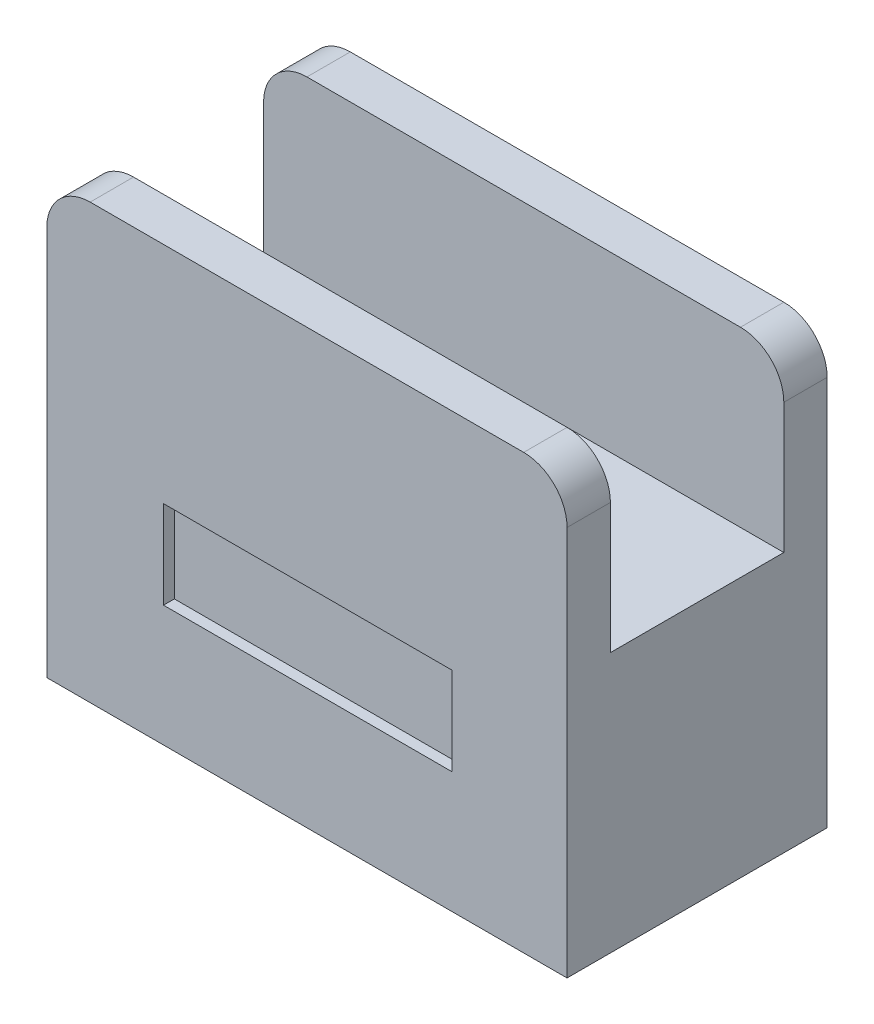
ISO-10303-21;
HEADER;
FILE_DESCRIPTION(('STEP AP214'),'2;1');
FILE_NAME('part.step','',(''),(''),'','','');
FILE_SCHEMA(('AUTOMOTIVE_DESIGN { 1 0 10303 214 1 1 1 1 }'));
ENDSEC;
DATA;
#1=APPLICATION_CONTEXT('core data for automotive mechanical design processes');
#2=APPLICATION_PROTOCOL_DEFINITION('international standard','automotive_design',2000,#1);
#3=PRODUCT_CONTEXT('',#1,'mechanical');
#4=PRODUCT('Part','Part','',(#3));
#5=PRODUCT_RELATED_PRODUCT_CATEGORY('part','',(#4));
#6=PRODUCT_DEFINITION_FORMATION('','',#4);
#7=PRODUCT_DEFINITION_CONTEXT('part definition',#1,'design');
#8=PRODUCT_DEFINITION('design','',#6,#7);
#9=PRODUCT_DEFINITION_SHAPE('','',#8);
#10=(LENGTH_UNIT() NAMED_UNIT(*) SI_UNIT(.MILLI.,.METRE.));
#11=(NAMED_UNIT(*) PLANE_ANGLE_UNIT() SI_UNIT($,.RADIAN.));
#12=(NAMED_UNIT(*) SI_UNIT($,.STERADIAN.) SOLID_ANGLE_UNIT());
#13=UNCERTAINTY_MEASURE_WITH_UNIT(LENGTH_MEASURE(1.E-05),#10,'distance_accuracy_value','');
#14=(GEOMETRIC_REPRESENTATION_CONTEXT(3) GLOBAL_UNCERTAINTY_ASSIGNED_CONTEXT((#13)) GLOBAL_UNIT_ASSIGNED_CONTEXT((#10,
#11,#12)) REPRESENTATION_CONTEXT('',''));
#15=CARTESIAN_POINT('',(0.,0.,0.));
#16=DIRECTION('',(0.,0.,1.));
#17=DIRECTION('',(1.,0.,0.));
#18=AXIS2_PLACEMENT_3D('',#15,#16,#17);
#19=CARTESIAN_POINT('',(0.,76.2,76.2));
#20=DIRECTION('',(0.,-1.,0.));
#21=DIRECTION('',(0.,0.,-1.));
#22=AXIS2_PLACEMENT_3D('',#19,#20,#21);
#23=PLANE('',#22);
#24=DIRECTION('',(0.,0.,-1.));
#25=VECTOR('',#24,1.);
#26=CARTESIAN_POINT('',(0.,76.2,76.2));
#27=LINE('',#26,#25);
#28=CARTESIAN_POINT('',(0.,76.2,63.5));
#29=VERTEX_POINT('',#28);
#30=CARTESIAN_POINT('',(0.,76.2,12.7));
#31=VERTEX_POINT('',#30);
#32=EDGE_CURVE('E253',#29,#31,#27,.T.);
#33=ORIENTED_EDGE('',*,*,#32,.F.);
#34=DIRECTION('',(1.,0.,0.));
#35=VECTOR('',#34,1.);
#36=CARTESIAN_POINT('',(0.,76.2,63.5));
#37=LINE('',#36,#35);
#38=CARTESIAN_POINT('',(152.4,76.2,63.5));
#39=VERTEX_POINT('',#38);
#40=EDGE_CURVE('E201',#29,#39,#37,.T.);
#41=ORIENTED_EDGE('',*,*,#40,.T.);
#42=DIRECTION('',(0.,0.,-1.));
#43=VECTOR('',#42,1.);
#44=CARTESIAN_POINT('',(152.4,76.2,76.2));
#45=LINE('',#44,#43);
#46=CARTESIAN_POINT('',(152.4,76.2,12.7));
#47=VERTEX_POINT('',#46);
#48=EDGE_CURVE('E265',#39,#47,#45,.T.);
#49=ORIENTED_EDGE('',*,*,#48,.T.);
#50=DIRECTION('',(1.,0.,0.));
#51=VECTOR('',#50,1.);
#52=CARTESIAN_POINT('',(0.,76.2,12.7));
#53=LINE('',#52,#51);
#54=EDGE_CURVE('E223',#31,#47,#53,.T.);
#55=ORIENTED_EDGE('',*,*,#54,.F.);
#56=EDGE_LOOP('',(#33,#41,#49,#55));
#57=FACE_BOUND('',#56,.T.);
#58=ADVANCED_FACE('F41',(#57),#23,.F.);
#59=CARTESIAN_POINT('',(0.,0.,76.2));
#60=DIRECTION('',(1.,0.,0.));
#61=DIRECTION('',(0.,0.,-1.));
#62=AXIS2_PLACEMENT_3D('',#59,#60,#61);
#63=PLANE('',#62);
#64=DIRECTION('',(0.,-1.,0.));
#65=VECTOR('',#64,1.);
#66=CARTESIAN_POINT('',(0.,127.,12.7));
#67=LINE('',#66,#65);
#68=CARTESIAN_POINT('',(0.,114.3,12.7));
#69=VERTEX_POINT('',#68);
#70=EDGE_CURVE('E238',#69,#31,#67,.T.);
#71=ORIENTED_EDGE('',*,*,#70,.F.);
#72=DIRECTION('',(0.,0.,1.));
#73=VECTOR('',#72,1.);
#74=CARTESIAN_POINT('',(0.,114.3,0.));
#75=LINE('',#74,#73);
#76=CARTESIAN_POINT('',(0.,114.3,0.));
#77=VERTEX_POINT('',#76);
#78=EDGE_CURVE('E295',#69,#77,#75,.F.);
#79=ORIENTED_EDGE('',*,*,#78,.T.);
#80=DIRECTION('',(0.,-1.,0.));
#81=VECTOR('',#80,1.);
#82=CARTESIAN_POINT('',(0.,0.,0.));
#83=LINE('',#82,#81);
#84=CARTESIAN_POINT('',(0.,0.,0.));
#85=VERTEX_POINT('',#84);
#86=EDGE_CURVE('E241',#77,#85,#83,.T.);
#87=ORIENTED_EDGE('',*,*,#86,.T.);
#88=DIRECTION('',(0.,0.,-1.));
#89=VECTOR('',#88,1.);
#90=CARTESIAN_POINT('',(0.,0.,76.2));
#91=LINE('',#90,#89);
#92=CARTESIAN_POINT('',(0.,0.,76.2));
#93=VERTEX_POINT('',#92);
#94=EDGE_CURVE('E273',#93,#85,#91,.T.);
#95=ORIENTED_EDGE('',*,*,#94,.F.);
#96=DIRECTION('',(0.,-1.,0.));
#97=VECTOR('',#96,1.);
#98=CARTESIAN_POINT('',(0.,0.,76.2));
#99=LINE('',#98,#97);
#100=CARTESIAN_POINT('',(0.,114.3,76.2));
#101=VERTEX_POINT('',#100);
#102=EDGE_CURVE('E242',#101,#93,#99,.T.);
#103=ORIENTED_EDGE('',*,*,#102,.F.);
#104=DIRECTION('',(0.,0.,-1.));
#105=VECTOR('',#104,1.);
#106=CARTESIAN_POINT('',(0.,114.3,63.5));
#107=LINE('',#106,#105);
#108=CARTESIAN_POINT('',(0.,114.3,63.5));
#109=VERTEX_POINT('',#108);
#110=EDGE_CURVE('E291',#101,#109,#107,.T.);
#111=ORIENTED_EDGE('',*,*,#110,.T.);
#112=DIRECTION('',(0.,-1.,0.));
#113=VECTOR('',#112,1.);
#114=CARTESIAN_POINT('',(0.,127.,63.5));
#115=LINE('',#114,#113);
#116=EDGE_CURVE('E214',#109,#29,#115,.T.);
#117=ORIENTED_EDGE('',*,*,#116,.T.);
#118=ORIENTED_EDGE('',*,*,#32,.T.);
#119=EDGE_LOOP('',(#71,#79,#87,#95,#103,#111,#117,#118));
#120=FACE_BOUND('',#119,.T.);
#121=ADVANCED_FACE('F339',(#120),#63,.F.);
#122=CARTESIAN_POINT('',(0.,0.,76.2));
#123=DIRECTION('',(0.,1.,0.));
#124=DIRECTION('',(0.,0.,1.));
#125=AXIS2_PLACEMENT_3D('',#122,#123,#124);
#126=PLANE('',#125);
#127=DIRECTION('',(1.,0.,0.));
#128=VECTOR('',#127,1.);
#129=CARTESIAN_POINT('',(0.,0.,0.));
#130=LINE('',#129,#128);
#131=CARTESIAN_POINT('',(152.4,0.,0.));
#132=VERTEX_POINT('',#131);
#133=EDGE_CURVE('E256',#85,#132,#130,.T.);
#134=ORIENTED_EDGE('',*,*,#133,.T.);
#135=DIRECTION('',(0.,0.,-1.));
#136=VECTOR('',#135,1.);
#137=CARTESIAN_POINT('',(152.4,0.,76.2));
#138=LINE('',#137,#136);
#139=CARTESIAN_POINT('',(152.4,0.,76.2));
#140=VERTEX_POINT('',#139);
#141=EDGE_CURVE('E269',#140,#132,#138,.T.);
#142=ORIENTED_EDGE('',*,*,#141,.F.);
#143=DIRECTION('',(1.,0.,0.));
#144=VECTOR('',#143,1.);
#145=CARTESIAN_POINT('',(0.,0.,76.2));
#146=LINE('',#145,#144);
#147=EDGE_CURVE('E245',#93,#140,#146,.T.);
#148=ORIENTED_EDGE('',*,*,#147,.F.);
#149=ORIENTED_EDGE('',*,*,#94,.T.);
#150=EDGE_LOOP('',(#134,#142,#148,#149));
#151=FACE_BOUND('',#150,.T.);
#152=ADVANCED_FACE('F343',(#151),#126,.F.);
#153=CARTESIAN_POINT('',(152.4,0.,76.2));
#154=DIRECTION('',(-1.,0.,0.));
#155=DIRECTION('',(0.,0.,1.));
#156=AXIS2_PLACEMENT_3D('',#153,#154,#155);
#157=PLANE('',#156);
#158=DIRECTION('',(0.,1.,0.));
#159=VECTOR('',#158,1.);
#160=CARTESIAN_POINT('',(152.4,0.,0.));
#161=LINE('',#160,#159);
#162=CARTESIAN_POINT('',(152.4,114.3,0.));
#163=VERTEX_POINT('',#162);
#164=EDGE_CURVE('E246',#132,#163,#161,.T.);
#165=ORIENTED_EDGE('',*,*,#164,.T.);
#166=DIRECTION('',(0.,0.,-1.));
#167=VECTOR('',#166,1.);
#168=CARTESIAN_POINT('',(152.4,114.3,12.7));
#169=LINE('',#168,#167);
#170=CARTESIAN_POINT('',(152.4,114.3,12.7));
#171=VERTEX_POINT('',#170);
#172=EDGE_CURVE('E308',#163,#171,#169,.F.);
#173=ORIENTED_EDGE('',*,*,#172,.T.);
#174=DIRECTION('',(0.,-1.,0.));
#175=VECTOR('',#174,1.);
#176=CARTESIAN_POINT('',(152.4,127.,12.7));
#177=LINE('',#176,#175);
#178=EDGE_CURVE('E232',#171,#47,#177,.T.);
#179=ORIENTED_EDGE('',*,*,#178,.T.);
#180=ORIENTED_EDGE('',*,*,#48,.F.);
#181=DIRECTION('',(0.,-1.,0.));
#182=VECTOR('',#181,1.);
#183=CARTESIAN_POINT('',(152.4,127.,63.5));
#184=LINE('',#183,#182);
#185=CARTESIAN_POINT('',(152.4,114.3,63.5));
#186=VERTEX_POINT('',#185);
#187=EDGE_CURVE('E220',#186,#39,#184,.T.);
#188=ORIENTED_EDGE('',*,*,#187,.F.);
#189=DIRECTION('',(0.,0.,1.));
#190=VECTOR('',#189,1.);
#191=CARTESIAN_POINT('',(152.4,114.3,76.2));
#192=LINE('',#191,#190);
#193=CARTESIAN_POINT('',(152.4,114.3,76.2));
#194=VERTEX_POINT('',#193);
#195=EDGE_CURVE('E304',#186,#194,#192,.T.);
#196=ORIENTED_EDGE('',*,*,#195,.T.);
#197=DIRECTION('',(0.,1.,0.));
#198=VECTOR('',#197,1.);
#199=CARTESIAN_POINT('',(152.4,0.,76.2));
#200=LINE('',#199,#198);
#201=EDGE_CURVE('E249',#140,#194,#200,.T.);
#202=ORIENTED_EDGE('',*,*,#201,.F.);
#203=ORIENTED_EDGE('',*,*,#141,.T.);
#204=EDGE_LOOP('',(#165,#173,#179,#180,#188,#196,#202,#203));
#205=FACE_BOUND('',#204,.T.);
#206=ADVANCED_FACE('F347',(#205),#157,.F.);
#207=CARTESIAN_POINT('',(0.,0.,76.2));
#208=DIRECTION('',(0.,0.,-1.));
#209=DIRECTION('',(-1.,0.,0.));
#210=AXIS2_PLACEMENT_3D('',#207,#208,#209);
#211=PLANE('',#210);
#212=DIRECTION('',(1.,0.,0.));
#213=VECTOR('',#212,1.);
#214=CARTESIAN_POINT('',(34.1858706307789,35.4773433120243,76.2));
#215=LINE('',#214,#213);
#216=CARTESIAN_POINT('',(34.1858706307789,35.4773433120243,76.2));
#217=VERTEX_POINT('',#216);
#218=CARTESIAN_POINT('',(118.647915764399,35.4773433120243,76.2));
#219=VERTEX_POINT('',#218);
#220=EDGE_CURVE('E192',#217,#219,#215,.T.);
#221=ORIENTED_EDGE('',*,*,#220,.F.);
#222=DIRECTION('',(0.,-1.,0.));
#223=VECTOR('',#222,1.);
#224=CARTESIAN_POINT('',(34.1858706307789,61.2467638674303,76.2));
#225=LINE('',#224,#223);
#226=CARTESIAN_POINT('',(34.1858706307789,61.2467638674303,76.2));
#227=VERTEX_POINT('',#226);
#228=EDGE_CURVE('E57',#227,#217,#225,.T.);
#229=ORIENTED_EDGE('',*,*,#228,.F.);
#230=DIRECTION('',(-1.,0.,0.));
#231=VECTOR('',#230,1.);
#232=CARTESIAN_POINT('',(34.1858706307789,61.2467638674303,76.2));
#233=LINE('',#232,#231);
#234=CARTESIAN_POINT('',(118.647915764399,61.2467638674303,76.2));
#235=VERTEX_POINT('',#234);
#236=EDGE_CURVE('E179',#235,#227,#233,.T.);
#237=ORIENTED_EDGE('',*,*,#236,.F.);
#238=DIRECTION('',(0.,1.,0.));
#239=VECTOR('',#238,1.);
#240=CARTESIAN_POINT('',(118.647915764399,61.2467638674303,76.2));
#241=LINE('',#240,#239);
#242=EDGE_CURVE('E183',#219,#235,#241,.T.);
#243=ORIENTED_EDGE('',*,*,#242,.F.);
#244=EDGE_LOOP('',(#221,#229,#237,#243));
#245=FACE_BOUND('',#244,.T.);
#246=ORIENTED_EDGE('',*,*,#201,.T.);
#247=CARTESIAN_POINT('',(139.7,114.3,76.2));
#248=DIRECTION('',(0.,0.,-1.));
#249=DIRECTION('',(-1.,0.,0.));
#250=AXIS2_PLACEMENT_3D('',#247,#248,#249);
#251=CIRCLE('',#250,12.7);
#252=CARTESIAN_POINT('',(139.7,127.,76.2));
#253=VERTEX_POINT('',#252);
#254=EDGE_CURVE('E314',#194,#253,#251,.F.);
#255=ORIENTED_EDGE('',*,*,#254,.T.);
#256=DIRECTION('',(-1.,0.,0.));
#257=VECTOR('',#256,1.);
#258=CARTESIAN_POINT('',(0.,127.,76.2));
#259=LINE('',#258,#257);
#260=CARTESIAN_POINT('',(12.7,127.,76.2));
#261=VERTEX_POINT('',#260);
#262=EDGE_CURVE('E207',#253,#261,#259,.T.);
#263=ORIENTED_EDGE('',*,*,#262,.T.);
#264=CARTESIAN_POINT('',(12.7,114.3,76.2));
#265=DIRECTION('',(0.,0.,-1.));
#266=DIRECTION('',(-1.,0.,0.));
#267=AXIS2_PLACEMENT_3D('',#264,#265,#266);
#268=CIRCLE('',#267,12.7);
#269=EDGE_CURVE('E311',#261,#101,#268,.F.);
#270=ORIENTED_EDGE('',*,*,#269,.T.);
#271=ORIENTED_EDGE('',*,*,#102,.T.);
#272=ORIENTED_EDGE('',*,*,#147,.T.);
#273=EDGE_LOOP('',(#246,#255,#263,#270,#271,#272));
#274=FACE_BOUND('',#273,.T.);
#275=ADVANCED_FACE('F334',(#245,#274),#211,.F.);
#276=CARTESIAN_POINT('',(0.,0.,0.));
#277=DIRECTION('',(0.,0.,-1.));
#278=DIRECTION('',(-1.,0.,0.));
#279=AXIS2_PLACEMENT_3D('',#276,#277,#278);
#280=PLANE('',#279);
#281=ORIENTED_EDGE('',*,*,#86,.F.);
#282=CARTESIAN_POINT('',(12.7,114.3,0.));
#283=DIRECTION('',(0.,0.,-1.));
#284=DIRECTION('',(-1.,0.,0.));
#285=AXIS2_PLACEMENT_3D('',#282,#283,#284);
#286=CIRCLE('',#285,12.7);
#287=CARTESIAN_POINT('',(12.7,127.,0.));
#288=VERTEX_POINT('',#287);
#289=EDGE_CURVE('E301',#77,#288,#286,.T.);
#290=ORIENTED_EDGE('',*,*,#289,.T.);
#291=DIRECTION('',(-1.,0.,0.));
#292=VECTOR('',#291,1.);
#293=CARTESIAN_POINT('',(0.,127.,0.));
#294=LINE('',#293,#292);
#295=CARTESIAN_POINT('',(139.7,127.,0.));
#296=VERTEX_POINT('',#295);
#297=EDGE_CURVE('E228',#296,#288,#294,.T.);
#298=ORIENTED_EDGE('',*,*,#297,.F.);
#299=CARTESIAN_POINT('',(139.7,114.3,0.));
#300=DIRECTION('',(0.,0.,-1.));
#301=DIRECTION('',(-1.,0.,0.));
#302=AXIS2_PLACEMENT_3D('',#299,#300,#301);
#303=CIRCLE('',#302,12.7);
#304=EDGE_CURVE('E298',#296,#163,#303,.T.);
#305=ORIENTED_EDGE('',*,*,#304,.T.);
#306=ORIENTED_EDGE('',*,*,#164,.F.);
#307=ORIENTED_EDGE('',*,*,#133,.F.);
#308=EDGE_LOOP('',(#281,#290,#298,#305,#306,#307));
#309=FACE_BOUND('',#308,.T.);
#310=ADVANCED_FACE('F371',(#309),#280,.T.);
#311=CARTESIAN_POINT('',(0.,127.,12.7));
#312=DIRECTION('',(0.,0.,-1.));
#313=DIRECTION('',(-1.,0.,0.));
#314=AXIS2_PLACEMENT_3D('',#311,#312,#313);
#315=PLANE('',#314);
#316=DIRECTION('',(1.,0.,0.));
#317=VECTOR('',#316,1.);
#318=CARTESIAN_POINT('',(0.,127.,12.7));
#319=LINE('',#318,#317);
#320=CARTESIAN_POINT('',(12.7,127.,12.7));
#321=VERTEX_POINT('',#320);
#322=CARTESIAN_POINT('',(139.7,127.,12.7));
#323=VERTEX_POINT('',#322);
#324=EDGE_CURVE('E224',#321,#323,#319,.T.);
#325=ORIENTED_EDGE('',*,*,#324,.F.);
#326=CARTESIAN_POINT('',(12.7,114.3,12.7));
#327=DIRECTION('',(0.,0.,-1.));
#328=DIRECTION('',(-1.,0.,0.));
#329=AXIS2_PLACEMENT_3D('',#326,#327,#328);
#330=CIRCLE('',#329,12.7);
#331=EDGE_CURVE('E288',#321,#69,#330,.F.);
#332=ORIENTED_EDGE('',*,*,#331,.T.);
#333=ORIENTED_EDGE('',*,*,#70,.T.);
#334=ORIENTED_EDGE('',*,*,#54,.T.);
#335=ORIENTED_EDGE('',*,*,#178,.F.);
#336=CARTESIAN_POINT('',(139.7,114.3,12.7));
#337=DIRECTION('',(0.,0.,-1.));
#338=DIRECTION('',(-1.,0.,0.));
#339=AXIS2_PLACEMENT_3D('',#336,#337,#338);
#340=CIRCLE('',#339,12.7);
#341=EDGE_CURVE('E285',#171,#323,#340,.F.);
#342=ORIENTED_EDGE('',*,*,#341,.T.);
#343=EDGE_LOOP('',(#325,#332,#333,#334,#335,#342));
#344=FACE_BOUND('',#343,.T.);
#345=ADVANCED_FACE('F362',(#344),#315,.F.);
#346=CARTESIAN_POINT('',(0.,127.,0.));
#347=DIRECTION('',(0.,1.,0.));
#348=DIRECTION('',(0.,0.,1.));
#349=AXIS2_PLACEMENT_3D('',#346,#347,#348);
#350=PLANE('',#349);
#351=ORIENTED_EDGE('',*,*,#297,.T.);
#352=DIRECTION('',(0.,0.,1.));
#353=VECTOR('',#352,1.);
#354=CARTESIAN_POINT('',(12.7,127.,12.7));
#355=LINE('',#354,#353);
#356=EDGE_CURVE('E281',#288,#321,#355,.T.);
#357=ORIENTED_EDGE('',*,*,#356,.T.);
#358=ORIENTED_EDGE('',*,*,#324,.T.);
#359=DIRECTION('',(0.,0.,-1.));
#360=VECTOR('',#359,1.);
#361=CARTESIAN_POINT('',(139.7,127.,0.));
#362=LINE('',#361,#360);
#363=EDGE_CURVE('E277',#323,#296,#362,.T.);
#364=ORIENTED_EDGE('',*,*,#363,.T.);
#365=EDGE_LOOP('',(#351,#357,#358,#364));
#366=FACE_BOUND('',#365,.T.);
#367=ADVANCED_FACE('F368',(#366),#350,.T.);
#368=CARTESIAN_POINT('',(0.,127.,63.5));
#369=DIRECTION('',(0.,0.,-1.));
#370=DIRECTION('',(-1.,0.,0.));
#371=AXIS2_PLACEMENT_3D('',#368,#369,#370);
#372=PLANE('',#371);
#373=DIRECTION('',(1.,0.,0.));
#374=VECTOR('',#373,1.);
#375=CARTESIAN_POINT('',(0.,127.,63.5));
#376=LINE('',#375,#374);
#377=CARTESIAN_POINT('',(12.7,127.,63.5));
#378=VERTEX_POINT('',#377);
#379=CARTESIAN_POINT('',(139.7,127.,63.5));
#380=VERTEX_POINT('',#379);
#381=EDGE_CURVE('E211',#378,#380,#376,.T.);
#382=ORIENTED_EDGE('',*,*,#381,.T.);
#383=CARTESIAN_POINT('',(139.7,114.3,63.5));
#384=DIRECTION('',(0.,0.,-1.));
#385=DIRECTION('',(-1.,0.,0.));
#386=AXIS2_PLACEMENT_3D('',#383,#384,#385);
#387=CIRCLE('',#386,12.7);
#388=EDGE_CURVE('E11',#380,#186,#387,.T.);
#389=ORIENTED_EDGE('',*,*,#388,.T.);
#390=ORIENTED_EDGE('',*,*,#187,.T.);
#391=ORIENTED_EDGE('',*,*,#40,.F.);
#392=ORIENTED_EDGE('',*,*,#116,.F.);
#393=CARTESIAN_POINT('',(12.7,114.3,63.5));
#394=DIRECTION('',(0.,0.,-1.));
#395=DIRECTION('',(-1.,0.,0.));
#396=AXIS2_PLACEMENT_3D('',#393,#394,#395);
#397=CIRCLE('',#396,12.7);
#398=EDGE_CURVE('E50',#109,#378,#397,.T.);
#399=ORIENTED_EDGE('',*,*,#398,.T.);
#400=EDGE_LOOP('',(#382,#389,#390,#391,#392,#399));
#401=FACE_BOUND('',#400,.T.);
#402=ADVANCED_FACE('F324',(#401),#372,.T.);
#403=CARTESIAN_POINT('',(0.,127.,76.2));
#404=DIRECTION('',(0.,1.,0.));
#405=DIRECTION('',(0.,0.,-1.));
#406=AXIS2_PLACEMENT_3D('',#403,#404,#405);
#407=PLANE('',#406);
#408=ORIENTED_EDGE('',*,*,#262,.F.);
#409=DIRECTION('',(0.,0.,1.));
#410=VECTOR('',#409,1.);
#411=CARTESIAN_POINT('',(139.7,127.,63.5));
#412=LINE('',#411,#410);
#413=EDGE_CURVE('E65',#253,#380,#412,.F.);
#414=ORIENTED_EDGE('',*,*,#413,.T.);
#415=ORIENTED_EDGE('',*,*,#381,.F.);
#416=DIRECTION('',(0.,0.,-1.));
#417=VECTOR('',#416,1.);
#418=CARTESIAN_POINT('',(12.7,127.,76.2));
#419=LINE('',#418,#417);
#420=EDGE_CURVE('E317',#378,#261,#419,.F.);
#421=ORIENTED_EDGE('',*,*,#420,.T.);
#422=EDGE_LOOP('',(#408,#414,#415,#421));
#423=FACE_BOUND('',#422,.T.);
#424=ADVANCED_FACE('F330',(#423),#407,.T.);
#425=CARTESIAN_POINT('',(12.7,114.3,0.));
#426=DIRECTION('',(0.,0.,-1.));
#427=DIRECTION('',(-1.,0.,0.));
#428=AXIS2_PLACEMENT_3D('',#425,#426,#427);
#429=CYLINDRICAL_SURFACE('',#428,12.7);
#430=ORIENTED_EDGE('',*,*,#289,.F.);
#431=ORIENTED_EDGE('',*,*,#78,.F.);
#432=ORIENTED_EDGE('',*,*,#331,.F.);
#433=ORIENTED_EDGE('',*,*,#356,.F.);
#434=EDGE_LOOP('',(#430,#431,#432,#433));
#435=FACE_BOUND('',#434,.T.);
#436=ADVANCED_FACE('F375',(#435),#429,.T.);
#437=CARTESIAN_POINT('',(139.7,114.3,0.));
#438=DIRECTION('',(0.,0.,1.));
#439=DIRECTION('',(1.,0.,0.));
#440=AXIS2_PLACEMENT_3D('',#437,#438,#439);
#441=CYLINDRICAL_SURFACE('',#440,12.7);
#442=ORIENTED_EDGE('',*,*,#341,.F.);
#443=ORIENTED_EDGE('',*,*,#172,.F.);
#444=ORIENTED_EDGE('',*,*,#304,.F.);
#445=ORIENTED_EDGE('',*,*,#363,.F.);
#446=EDGE_LOOP('',(#442,#443,#444,#445));
#447=FACE_BOUND('',#446,.T.);
#448=ADVANCED_FACE('F365',(#447),#441,.T.);
#449=CARTESIAN_POINT('',(139.7,114.3,76.2));
#450=DIRECTION('',(0.,0.,-1.));
#451=DIRECTION('',(-1.,0.,0.));
#452=AXIS2_PLACEMENT_3D('',#449,#450,#451);
#453=CYLINDRICAL_SURFACE('',#452,12.7);
#454=ORIENTED_EDGE('',*,*,#388,.F.);
#455=ORIENTED_EDGE('',*,*,#413,.F.);
#456=ORIENTED_EDGE('',*,*,#254,.F.);
#457=ORIENTED_EDGE('',*,*,#195,.F.);
#458=EDGE_LOOP('',(#454,#455,#456,#457));
#459=FACE_BOUND('',#458,.T.);
#460=ADVANCED_FACE('F353',(#459),#453,.T.);
#461=CARTESIAN_POINT('',(12.7,114.3,76.2));
#462=DIRECTION('',(0.,0.,1.));
#463=DIRECTION('',(1.,0.,0.));
#464=AXIS2_PLACEMENT_3D('',#461,#462,#463);
#465=CYLINDRICAL_SURFACE('',#464,12.7);
#466=ORIENTED_EDGE('',*,*,#269,.F.);
#467=ORIENTED_EDGE('',*,*,#420,.F.);
#468=ORIENTED_EDGE('',*,*,#398,.F.);
#469=ORIENTED_EDGE('',*,*,#110,.F.);
#470=EDGE_LOOP('',(#466,#467,#468,#469));
#471=FACE_BOUND('',#470,.T.);
#472=ADVANCED_FACE('F43',(#471),#465,.T.);
#473=CARTESIAN_POINT('',(34.1858706307789,61.2467638674303,73.025));
#474=DIRECTION('',(-1.,0.,0.));
#475=DIRECTION('',(0.,0.,1.));
#476=AXIS2_PLACEMENT_3D('',#473,#474,#475);
#477=PLANE('',#476);
#478=ORIENTED_EDGE('',*,*,#228,.T.);
#479=DIRECTION('',(0.,0.,1.));
#480=VECTOR('',#479,1.);
#481=CARTESIAN_POINT('',(34.1858706307789,35.4773433120243,73.025));
#482=LINE('',#481,#480);
#483=CARTESIAN_POINT('',(34.1858706307789,35.4773433120243,73.025));
#484=VERTEX_POINT('',#483);
#485=EDGE_CURVE('E154',#484,#217,#482,.T.);
#486=ORIENTED_EDGE('',*,*,#485,.F.);
#487=DIRECTION('',(0.,-1.,0.));
#488=VECTOR('',#487,1.);
#489=CARTESIAN_POINT('',(34.1858706307789,61.2467638674303,73.025));
#490=LINE('',#489,#488);
#491=CARTESIAN_POINT('',(34.1858706307789,61.2467638674303,73.025));
#492=VERTEX_POINT('',#491);
#493=EDGE_CURVE('E158',#492,#484,#490,.T.);
#494=ORIENTED_EDGE('',*,*,#493,.F.);
#495=DIRECTION('',(0.,0.,1.));
#496=VECTOR('',#495,1.);
#497=CARTESIAN_POINT('',(34.1858706307789,61.2467638674303,73.025));
#498=LINE('',#497,#496);
#499=EDGE_CURVE('E198',#492,#227,#498,.T.);
#500=ORIENTED_EDGE('',*,*,#499,.T.);
#501=EDGE_LOOP('',(#478,#486,#494,#500));
#502=FACE_BOUND('',#501,.T.);
#503=ADVANCED_FACE('F156',(#502),#477,.F.);
#504=CARTESIAN_POINT('',(34.1858706307789,61.2467638674303,73.025));
#505=DIRECTION('',(0.,1.,0.));
#506=DIRECTION('',(0.,0.,1.));
#507=AXIS2_PLACEMENT_3D('',#504,#505,#506);
#508=PLANE('',#507);
#509=ORIENTED_EDGE('',*,*,#236,.T.);
#510=ORIENTED_EDGE('',*,*,#499,.F.);
#511=DIRECTION('',(-1.,0.,0.));
#512=VECTOR('',#511,1.);
#513=CARTESIAN_POINT('',(34.1858706307789,61.2467638674303,73.025));
#514=LINE('',#513,#512);
#515=CARTESIAN_POINT('',(118.647915764399,61.2467638674303,73.025));
#516=VERTEX_POINT('',#515);
#517=EDGE_CURVE('E165',#516,#492,#514,.T.);
#518=ORIENTED_EDGE('',*,*,#517,.F.);
#519=DIRECTION('',(0.,0.,1.));
#520=VECTOR('',#519,1.);
#521=CARTESIAN_POINT('',(118.647915764399,61.2467638674303,73.025));
#522=LINE('',#521,#520);
#523=EDGE_CURVE('E202',#516,#235,#522,.T.);
#524=ORIENTED_EDGE('',*,*,#523,.T.);
#525=EDGE_LOOP('',(#509,#510,#518,#524));
#526=FACE_BOUND('',#525,.T.);
#527=ADVANCED_FACE('F470',(#526),#508,.F.);
#528=CARTESIAN_POINT('',(118.647915764399,61.2467638674303,73.025));
#529=DIRECTION('',(1.,0.,0.));
#530=DIRECTION('',(0.,0.,-1.));
#531=AXIS2_PLACEMENT_3D('',#528,#529,#530);
#532=PLANE('',#531);
#533=ORIENTED_EDGE('',*,*,#242,.T.);
#534=ORIENTED_EDGE('',*,*,#523,.F.);
#535=DIRECTION('',(0.,1.,0.));
#536=VECTOR('',#535,1.);
#537=CARTESIAN_POINT('',(118.647915764399,61.2467638674303,73.025));
#538=LINE('',#537,#536);
#539=CARTESIAN_POINT('',(118.647915764399,35.4773433120243,73.025));
#540=VERTEX_POINT('',#539);
#541=EDGE_CURVE('E174',#540,#516,#538,.T.);
#542=ORIENTED_EDGE('',*,*,#541,.F.);
#543=DIRECTION('',(0.,0.,1.));
#544=VECTOR('',#543,1.);
#545=CARTESIAN_POINT('',(118.647915764399,35.4773433120243,73.025));
#546=LINE('',#545,#544);
#547=EDGE_CURVE('E164',#540,#219,#546,.T.);
#548=ORIENTED_EDGE('',*,*,#547,.T.);
#549=EDGE_LOOP('',(#533,#534,#542,#548));
#550=FACE_BOUND('',#549,.T.);
#551=ADVANCED_FACE('F476',(#550),#532,.F.);
#552=CARTESIAN_POINT('',(34.1858706307789,35.4773433120243,73.025));
#553=DIRECTION('',(0.,-1.,0.));
#554=DIRECTION('',(0.,0.,-1.));
#555=AXIS2_PLACEMENT_3D('',#552,#553,#554);
#556=PLANE('',#555);
#557=ORIENTED_EDGE('',*,*,#220,.T.);
#558=ORIENTED_EDGE('',*,*,#547,.F.);
#559=DIRECTION('',(1.,0.,0.));
#560=VECTOR('',#559,1.);
#561=CARTESIAN_POINT('',(34.1858706307789,35.4773433120243,73.025));
#562=LINE('',#561,#560);
#563=EDGE_CURVE('E168',#484,#540,#562,.T.);
#564=ORIENTED_EDGE('',*,*,#563,.F.);
#565=ORIENTED_EDGE('',*,*,#485,.T.);
#566=EDGE_LOOP('',(#557,#558,#564,#565));
#567=FACE_BOUND('',#566,.T.);
#568=ADVANCED_FACE('F169',(#567),#556,.F.);
#569=CARTESIAN_POINT('',(0.,0.,73.025));
#570=DIRECTION('',(0.,0.,1.));
#571=DIRECTION('',(1.,0.,0.));
#572=AXIS2_PLACEMENT_3D('',#569,#570,#571);
#573=PLANE('',#572);
#574=ORIENTED_EDGE('',*,*,#493,.T.);
#575=ORIENTED_EDGE('',*,*,#563,.T.);
#576=ORIENTED_EDGE('',*,*,#541,.T.);
#577=ORIENTED_EDGE('',*,*,#517,.T.);
#578=EDGE_LOOP('',(#574,#575,#576,#577));
#579=FACE_BOUND('',#578,.T.);
#580=ADVANCED_FACE('F176',(#579),#573,.T.);
#581=CLOSED_SHELL('',(#58,#121,#152,#206,#275,#310,#345,#367,#402,#424,#436,#448,#460,#472,#503,
#527,#551,#568,#580));
#582=MANIFOLD_SOLID_BREP('B2',#581);
#583=ADVANCED_BREP_SHAPE_REPRESENTATION('',(#18,#582),#14);
#584=SHAPE_DEFINITION_REPRESENTATION(#9,#583);
ENDSEC;
END-ISO-10303-21;
